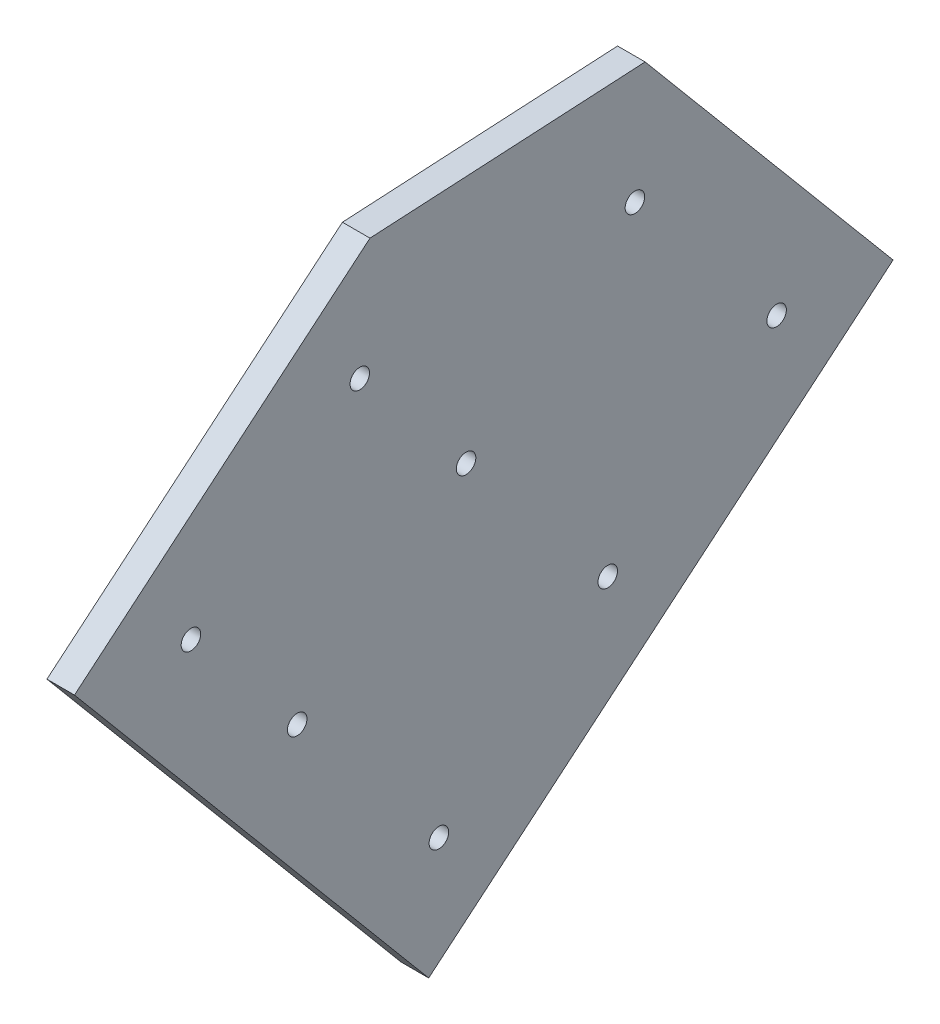
ISO-10303-21;
HEADER;
FILE_DESCRIPTION(('STEP AP214'),'2;1');
FILE_NAME('part.step','',(''),(''),'','','');
FILE_SCHEMA(('AUTOMOTIVE_DESIGN { 1 0 10303 214 1 1 1 1 }'));
ENDSEC;
DATA;
#1=APPLICATION_CONTEXT('core data for automotive mechanical design processes');
#2=APPLICATION_PROTOCOL_DEFINITION('international standard','automotive_design',2000,#1);
#3=PRODUCT_CONTEXT('',#1,'mechanical');
#4=PRODUCT('Part','Part','',(#3));
#5=PRODUCT_RELATED_PRODUCT_CATEGORY('part','',(#4));
#6=PRODUCT_DEFINITION_FORMATION('','',#4);
#7=PRODUCT_DEFINITION_CONTEXT('part definition',#1,'design');
#8=PRODUCT_DEFINITION('design','',#6,#7);
#9=PRODUCT_DEFINITION_SHAPE('','',#8);
#10=(LENGTH_UNIT() NAMED_UNIT(*) SI_UNIT(.MILLI.,.METRE.));
#11=(NAMED_UNIT(*) PLANE_ANGLE_UNIT() SI_UNIT($,.RADIAN.));
#12=(NAMED_UNIT(*) SI_UNIT($,.STERADIAN.) SOLID_ANGLE_UNIT());
#13=UNCERTAINTY_MEASURE_WITH_UNIT(LENGTH_MEASURE(1.E-05),#10,'distance_accuracy_value','');
#14=(GEOMETRIC_REPRESENTATION_CONTEXT(3) GLOBAL_UNCERTAINTY_ASSIGNED_CONTEXT((#13)) GLOBAL_UNIT_ASSIGNED_CONTEXT((#10,
#11,#12)) REPRESENTATION_CONTEXT('',''));
#15=CARTESIAN_POINT('',(0.,0.,0.));
#16=DIRECTION('',(0.,0.,1.));
#17=DIRECTION('',(1.,0.,0.));
#18=AXIS2_PLACEMENT_3D('',#15,#16,#17);
#19=CARTESIAN_POINT('',(50.9270000000001,-283.843632269091,871.911988961986));
#20=DIRECTION('',(0.,-0.766044443118978,-0.64278760968654));
#21=DIRECTION('',(0.,0.64278760968654,-0.766044443118978));
#22=AXIS2_PLACEMENT_3D('',#19,#20,#21);
#23=PLANE('',#22);
#24=DIRECTION('',(0.,0.64278760968654,-0.766044443118978));
#25=VECTOR('',#24,1.);
#26=CARTESIAN_POINT('',(57.2770000000001,-283.843632269091,871.911988961986));
#27=LINE('',#26,#25);
#28=CARTESIAN_POINT('',(57.2770000000001,-340.987450770225,940.013339955263));
#29=VERTEX_POINT('',#28);
#30=CARTESIAN_POINT('',(57.2770000000001,-283.843632269091,871.911988961986));
#31=VERTEX_POINT('',#30);
#32=EDGE_CURVE('E117',#29,#31,#27,.T.);
#33=ORIENTED_EDGE('',*,*,#32,.T.);
#34=DIRECTION('',(1.,0.,0.));
#35=VECTOR('',#34,1.);
#36=CARTESIAN_POINT('',(50.9270000000001,-283.843632269091,871.911988961986));
#37=LINE('',#36,#35);
#38=CARTESIAN_POINT('',(50.9270000000001,-283.843632269091,871.911988961986));
#39=VERTEX_POINT('',#38);
#40=EDGE_CURVE('E11',#39,#31,#37,.T.);
#41=ORIENTED_EDGE('',*,*,#40,.F.);
#42=DIRECTION('',(0.,0.64278760968654,-0.766044443118978));
#43=VECTOR('',#42,1.);
#44=CARTESIAN_POINT('',(50.9270000000001,-283.843632269091,871.911988961986));
#45=LINE('',#44,#43);
#46=CARTESIAN_POINT('',(50.9270000000001,-340.987450770225,940.013339955263));
#47=VERTEX_POINT('',#46);
#48=EDGE_CURVE('E131',#47,#39,#45,.T.);
#49=ORIENTED_EDGE('',*,*,#48,.F.);
#50=DIRECTION('',(1.,0.,0.));
#51=VECTOR('',#50,1.);
#52=CARTESIAN_POINT('',(50.9270000000001,-340.987450770225,940.013339955263));
#53=LINE('',#52,#51);
#54=EDGE_CURVE('E113',#47,#29,#53,.T.);
#55=ORIENTED_EDGE('',*,*,#54,.T.);
#56=EDGE_LOOP('',(#33,#41,#49,#55));
#57=FACE_BOUND('',#56,.T.);
#58=ADVANCED_FACE('F38',(#57),#23,.F.);
#59=CARTESIAN_POINT('',(50.9270000000001,-280.376314979848,808.506723322485));
#60=DIRECTION('',(0.,-0.998508120307106,-0.0546034218778467));
#61=DIRECTION('',(0.,0.0546034218778467,-0.998508120307106));
#62=AXIS2_PLACEMENT_3D('',#59,#60,#61);
#63=PLANE('',#62);
#64=DIRECTION('',(0.,0.0546034218778467,-0.998508120307106));
#65=VECTOR('',#64,1.);
#66=CARTESIAN_POINT('',(57.2770000000001,-280.376314979848,808.506723322485));
#67=LINE('',#66,#65);
#68=CARTESIAN_POINT('',(57.2770000000001,-280.376314979848,808.506723322485));
#69=VERTEX_POINT('',#68);
#70=EDGE_CURVE('E121',#31,#69,#67,.T.);
#71=ORIENTED_EDGE('',*,*,#70,.T.);
#72=DIRECTION('',(1.,0.,0.));
#73=VECTOR('',#72,1.);
#74=CARTESIAN_POINT('',(50.9270000000001,-280.376314979848,808.506723322485));
#75=LINE('',#74,#73);
#76=CARTESIAN_POINT('',(50.9270000000001,-280.376314979848,808.506723322485));
#77=VERTEX_POINT('',#76);
#78=EDGE_CURVE('E47',#77,#69,#75,.T.);
#79=ORIENTED_EDGE('',*,*,#78,.F.);
#80=DIRECTION('',(0.,0.0546034218778467,-0.998508120307106));
#81=VECTOR('',#80,1.);
#82=CARTESIAN_POINT('',(50.9270000000001,-280.376314979848,808.506723322485));
#83=LINE('',#82,#81);
#84=EDGE_CURVE('E89',#39,#77,#83,.T.);
#85=ORIENTED_EDGE('',*,*,#84,.F.);
#86=ORIENTED_EDGE('',*,*,#40,.T.);
#87=EDGE_LOOP('',(#71,#79,#85,#86));
#88=FACE_BOUND('',#87,.T.);
#89=ADVANCED_FACE('F154',(#88),#63,.F.);
#90=CARTESIAN_POINT('',(50.9270000000001,-348.477665973125,751.362904821351));
#91=DIRECTION('',(0.,-0.64278760968654,0.766044443118977));
#92=DIRECTION('',(0.,-0.766044443118977,-0.64278760968654));
#93=AXIS2_PLACEMENT_3D('',#90,#91,#92);
#94=PLANE('',#93);
#95=DIRECTION('',(0.,-0.766044443118977,-0.64278760968654));
#96=VECTOR('',#95,1.);
#97=CARTESIAN_POINT('',(57.2770000000001,-348.477665973125,751.362904821351));
#98=LINE('',#97,#96);
#99=CARTESIAN_POINT('',(57.2770000000001,-348.477665973125,751.362904821351));
#100=VERTEX_POINT('',#99);
#101=EDGE_CURVE('E105',#69,#100,#98,.T.);
#102=ORIENTED_EDGE('',*,*,#101,.T.);
#103=DIRECTION('',(1.,0.,0.));
#104=VECTOR('',#103,1.);
#105=CARTESIAN_POINT('',(50.9270000000001,-348.477665973125,751.362904821351));
#106=LINE('',#105,#104);
#107=CARTESIAN_POINT('',(50.9270000000001,-348.477665973125,751.362904821351));
#108=VERTEX_POINT('',#107);
#109=EDGE_CURVE('E102',#108,#100,#106,.T.);
#110=ORIENTED_EDGE('',*,*,#109,.F.);
#111=DIRECTION('',(0.,-0.766044443118977,-0.64278760968654));
#112=VECTOR('',#111,1.);
#113=CARTESIAN_POINT('',(50.9270000000001,-348.477665973125,751.362904821351));
#114=LINE('',#113,#112);
#115=EDGE_CURVE('E93',#77,#108,#114,.T.);
#116=ORIENTED_EDGE('',*,*,#115,.F.);
#117=ORIENTED_EDGE('',*,*,#78,.T.);
#118=EDGE_LOOP('',(#102,#110,#116,#117));
#119=FACE_BOUND('',#118,.T.);
#120=ADVANCED_FACE('F103',(#119),#94,.F.);
#121=CARTESIAN_POINT('',(50.9270000000001,-438.275095046335,858.379313525072));
#122=DIRECTION('',(0.,0.766044443118977,0.642787609686541));
#123=DIRECTION('',(0.,-0.642787609686541,0.766044443118977));
#124=AXIS2_PLACEMENT_3D('',#121,#122,#123);
#125=PLANE('',#124);
#126=DIRECTION('',(0.,-0.642787609686541,0.766044443118977));
#127=VECTOR('',#126,1.);
#128=CARTESIAN_POINT('',(57.2770000000001,-438.275095046335,858.379313525072));
#129=LINE('',#128,#127);
#130=CARTESIAN_POINT('',(57.2770000000001,-438.275095046335,858.379313525072));
#131=VERTEX_POINT('',#130);
#132=EDGE_CURVE('E75',#100,#131,#129,.T.);
#133=ORIENTED_EDGE('',*,*,#132,.T.);
#134=DIRECTION('',(1.,0.,0.));
#135=VECTOR('',#134,1.);
#136=CARTESIAN_POINT('',(50.9270000000001,-438.275095046335,858.379313525072));
#137=LINE('',#136,#135);
#138=CARTESIAN_POINT('',(50.9270000000001,-438.275095046335,858.379313525072));
#139=VERTEX_POINT('',#138);
#140=EDGE_CURVE('E107',#139,#131,#137,.T.);
#141=ORIENTED_EDGE('',*,*,#140,.F.);
#142=DIRECTION('',(0.,-0.642787609686541,0.766044443118977));
#143=VECTOR('',#142,1.);
#144=CARTESIAN_POINT('',(50.9270000000001,-438.275095046335,858.379313525072));
#145=LINE('',#144,#143);
#146=EDGE_CURVE('E97',#108,#139,#145,.T.);
#147=ORIENTED_EDGE('',*,*,#146,.F.);
#148=ORIENTED_EDGE('',*,*,#109,.T.);
#149=EDGE_LOOP('',(#133,#141,#147,#148));
#150=FACE_BOUND('',#149,.T.);
#151=ADVANCED_FACE('F109',(#150),#125,.F.);
#152=CARTESIAN_POINT('',(50.9270000000001,-340.987450770225,940.013339955263));
#153=DIRECTION('',(0.,0.64278760968654,-0.766044443118977));
#154=DIRECTION('',(0.,0.766044443118977,0.642787609686541));
#155=AXIS2_PLACEMENT_3D('',#152,#153,#154);
#156=PLANE('',#155);
#157=DIRECTION('',(0.,0.766044443118977,0.64278760968654));
#158=VECTOR('',#157,1.);
#159=CARTESIAN_POINT('',(57.2770000000001,-340.987450770225,940.013339955263));
#160=LINE('',#159,#158);
#161=EDGE_CURVE('E81',#131,#29,#160,.T.);
#162=ORIENTED_EDGE('',*,*,#161,.T.);
#163=ORIENTED_EDGE('',*,*,#54,.F.);
#164=DIRECTION('',(0.,0.766044443118977,0.64278760968654));
#165=VECTOR('',#164,1.);
#166=CARTESIAN_POINT('',(50.9270000000001,-340.987450770225,940.013339955263));
#167=LINE('',#166,#165);
#168=EDGE_CURVE('E55',#139,#47,#167,.T.);
#169=ORIENTED_EDGE('',*,*,#168,.F.);
#170=ORIENTED_EDGE('',*,*,#140,.T.);
#171=EDGE_LOOP('',(#162,#163,#169,#170));
#172=FACE_BOUND('',#171,.T.);
#173=ADVANCED_FACE('F142',(#172),#156,.F.);
#174=CARTESIAN_POINT('',(50.927,0.,0.));
#175=DIRECTION('',(1.,0.,0.));
#176=DIRECTION('',(0.,1.,0.));
#177=AXIS2_PLACEMENT_3D('',#174,#175,#176);
#178=PLANE('',#177);
#179=CARTESIAN_POINT('',(50.9270000000001,-310.681882875036,874.260031638874));
#180=DIRECTION('',(-1.,0.,0.));
#181=DIRECTION('',(0.,0.,1.));
#182=AXIS2_PLACEMENT_3D('',#179,#180,#181);
#183=CIRCLE('',#182,4.21640000000001);
#184=CARTESIAN_POINT('',(50.9270000000001,-310.681882875036,878.476431638874));
#185=VERTEX_POINT('',#184);
#186=EDGE_CURVE('E358',#185,#185,#183,.T.);
#187=ORIENTED_EDGE('',*,*,#186,.F.);
#188=EDGE_LOOP('',(#187));
#189=FACE_BOUND('',#188,.T.);
#190=CARTESIAN_POINT('',(50.9270000000002,-343.335493447113,913.175089349318));
#191=DIRECTION('',(-1.,0.,0.));
#192=DIRECTION('',(0.,0.,1.));
#193=AXIS2_PLACEMENT_3D('',#190,#191,#192);
#194=CIRCLE('',#193,4.21640000000001);
#195=CARTESIAN_POINT('',(50.9270000000002,-343.335493447113,917.391489349318));
#196=VERTEX_POINT('',#195);
#197=EDGE_CURVE('E368',#196,#196,#194,.T.);
#198=ORIENTED_EDGE('',*,*,#197,.F.);
#199=EDGE_LOOP('',(#198));
#200=FACE_BOUND('',#199,.T.);
#201=CARTESIAN_POINT('',(50.9270000000002,-372.521786729946,888.684881420261));
#202=DIRECTION('',(-1.,0.,0.));
#203=DIRECTION('',(0.,0.,1.));
#204=AXIS2_PLACEMENT_3D('',#201,#202,#203);
#205=CIRCLE('',#204,4.21640000000001);
#206=CARTESIAN_POINT('',(50.9270000000002,-372.521786729946,892.901281420261));
#207=VERTEX_POINT('',#206);
#208=EDGE_CURVE('E380',#207,#207,#205,.T.);
#209=ORIENTED_EDGE('',*,*,#208,.F.);
#210=EDGE_LOOP('',(#209));
#211=FACE_BOUND('',#210,.T.);
#212=CARTESIAN_POINT('',(50.9270000000002,-411.43684444039,856.031270848185));
#213=DIRECTION('',(-1.,0.,0.));
#214=DIRECTION('',(0.,0.,1.));
#215=AXIS2_PLACEMENT_3D('',#212,#213,#214);
#216=CIRCLE('',#215,4.21640000000001);
#217=CARTESIAN_POINT('',(50.9270000000002,-411.43684444039,860.247670848185));
#218=VERTEX_POINT('',#217);
#219=EDGE_CURVE('E392',#218,#218,#216,.T.);
#220=ORIENTED_EDGE('',*,*,#219,.F.);
#221=EDGE_LOOP('',(#220));
#222=FACE_BOUND('',#221,.T.);
#223=CARTESIAN_POINT('',(50.9270000000002,-339.86817615787,849.769823709817));
#224=DIRECTION('',(-1.,0.,0.));
#225=DIRECTION('',(0.,0.,1.));
#226=AXIS2_PLACEMENT_3D('',#223,#224,#225);
#227=CIRCLE('',#226,4.21640000000001);
#228=CARTESIAN_POINT('',(50.9270000000002,-339.86817615787,853.986223709817));
#229=VERTEX_POINT('',#228);
#230=EDGE_CURVE('E404',#229,#229,#227,.T.);
#231=ORIENTED_EDGE('',*,*,#230,.F.);
#232=EDGE_LOOP('',(#231));
#233=FACE_BOUND('',#232,.T.);
#234=CARTESIAN_POINT('',(50.9270000000002,-378.783233868313,817.116213137741));
#235=DIRECTION('',(-1.,0.,0.));
#236=DIRECTION('',(0.,0.,1.));
#237=AXIS2_PLACEMENT_3D('',#234,#235,#236);
#238=CIRCLE('',#237,4.21640000000001);
#239=CARTESIAN_POINT('',(50.9270000000002,-378.783233868313,821.332613137741));
#240=VERTEX_POINT('',#239);
#241=EDGE_CURVE('E416',#240,#240,#238,.T.);
#242=ORIENTED_EDGE('',*,*,#241,.F.);
#243=EDGE_LOOP('',(#242));
#244=FACE_BOUND('',#243,.T.);
#245=CARTESIAN_POINT('',(50.9270000000001,-346.129623296237,778.201155427296));
#246=DIRECTION('',(-1.,0.,0.));
#247=DIRECTION('',(0.,0.,1.));
#248=AXIS2_PLACEMENT_3D('',#245,#246,#247);
#249=CIRCLE('',#248,4.21640000000001);
#250=CARTESIAN_POINT('',(50.9270000000001,-346.129623296237,782.417555427296));
#251=VERTEX_POINT('',#250);
#252=EDGE_CURVE('E428',#251,#251,#249,.T.);
#253=ORIENTED_EDGE('',*,*,#252,.F.);
#254=EDGE_LOOP('',(#253));
#255=FACE_BOUND('',#254,.T.);
#256=CARTESIAN_POINT('',(50.9270000000001,-307.214565585793,810.854765999373));
#257=DIRECTION('',(-1.,0.,0.));
#258=DIRECTION('',(0.,0.,1.));
#259=AXIS2_PLACEMENT_3D('',#256,#257,#258);
#260=CIRCLE('',#259,4.21640000000001);
#261=CARTESIAN_POINT('',(50.9270000000001,-307.214565585793,815.071165999373));
#262=VERTEX_POINT('',#261);
#263=EDGE_CURVE('E440',#262,#262,#260,.T.);
#264=ORIENTED_EDGE('',*,*,#263,.F.);
#265=EDGE_LOOP('',(#264));
#266=FACE_BOUND('',#265,.T.);
#267=ORIENTED_EDGE('',*,*,#48,.T.);
#268=ORIENTED_EDGE('',*,*,#84,.T.);
#269=ORIENTED_EDGE('',*,*,#115,.T.);
#270=ORIENTED_EDGE('',*,*,#146,.T.);
#271=ORIENTED_EDGE('',*,*,#168,.T.);
#272=EDGE_LOOP('',(#267,#268,#269,#270,#271));
#273=FACE_BOUND('',#272,.T.);
#274=ADVANCED_FACE('F95',(#189,#200,#211,#222,#233,#244,#255,#266,#273),#178,.F.);
#275=CARTESIAN_POINT('',(57.2770000000001,0.,0.));
#276=DIRECTION('',(1.,0.,0.));
#277=DIRECTION('',(0.,1.,0.));
#278=AXIS2_PLACEMENT_3D('',#275,#276,#277);
#279=PLANE('',#278);
#280=CARTESIAN_POINT('',(57.2770000000001,-310.681882875036,874.260031638874));
#281=DIRECTION('',(-1.,0.,0.));
#282=DIRECTION('',(0.,0.,1.));
#283=AXIS2_PLACEMENT_3D('',#280,#281,#282);
#284=CIRCLE('',#283,2.24789999999997);
#285=CARTESIAN_POINT('',(57.2770000000001,-310.681882875036,876.507931638874));
#286=VERTEX_POINT('',#285);
#287=EDGE_CURVE('E362',#286,#286,#284,.T.);
#288=ORIENTED_EDGE('',*,*,#287,.T.);
#289=EDGE_LOOP('',(#288));
#290=FACE_BOUND('',#289,.T.);
#291=CARTESIAN_POINT('',(57.2770000000002,-343.335493447113,913.175089349318));
#292=DIRECTION('',(-1.,0.,0.));
#293=DIRECTION('',(0.,0.,1.));
#294=AXIS2_PLACEMENT_3D('',#291,#292,#293);
#295=CIRCLE('',#294,2.24789999999997);
#296=CARTESIAN_POINT('',(57.2770000000002,-343.335493447113,915.422989349318));
#297=VERTEX_POINT('',#296);
#298=EDGE_CURVE('E376',#297,#297,#295,.T.);
#299=ORIENTED_EDGE('',*,*,#298,.T.);
#300=EDGE_LOOP('',(#299));
#301=FACE_BOUND('',#300,.T.);
#302=CARTESIAN_POINT('',(57.2770000000002,-372.521786729946,888.684881420261));
#303=DIRECTION('',(-1.,0.,0.));
#304=DIRECTION('',(0.,0.,1.));
#305=AXIS2_PLACEMENT_3D('',#302,#303,#304);
#306=CIRCLE('',#305,2.24789999999997);
#307=CARTESIAN_POINT('',(57.2770000000002,-372.521786729946,890.932781420261));
#308=VERTEX_POINT('',#307);
#309=EDGE_CURVE('E388',#308,#308,#306,.T.);
#310=ORIENTED_EDGE('',*,*,#309,.T.);
#311=EDGE_LOOP('',(#310));
#312=FACE_BOUND('',#311,.T.);
#313=CARTESIAN_POINT('',(57.2770000000002,-411.43684444039,856.031270848185));
#314=DIRECTION('',(-1.,0.,0.));
#315=DIRECTION('',(0.,0.,1.));
#316=AXIS2_PLACEMENT_3D('',#313,#314,#315);
#317=CIRCLE('',#316,2.24789999999997);
#318=CARTESIAN_POINT('',(57.2770000000002,-411.43684444039,858.279170848185));
#319=VERTEX_POINT('',#318);
#320=EDGE_CURVE('E400',#319,#319,#317,.T.);
#321=ORIENTED_EDGE('',*,*,#320,.T.);
#322=EDGE_LOOP('',(#321));
#323=FACE_BOUND('',#322,.T.);
#324=CARTESIAN_POINT('',(57.2770000000002,-339.86817615787,849.769823709817));
#325=DIRECTION('',(-1.,0.,0.));
#326=DIRECTION('',(0.,0.,1.));
#327=AXIS2_PLACEMENT_3D('',#324,#325,#326);
#328=CIRCLE('',#327,2.24789999999997);
#329=CARTESIAN_POINT('',(57.2770000000002,-339.86817615787,852.017723709817));
#330=VERTEX_POINT('',#329);
#331=EDGE_CURVE('E412',#330,#330,#328,.T.);
#332=ORIENTED_EDGE('',*,*,#331,.T.);
#333=EDGE_LOOP('',(#332));
#334=FACE_BOUND('',#333,.T.);
#335=CARTESIAN_POINT('',(57.2770000000002,-378.783233868313,817.116213137741));
#336=DIRECTION('',(-1.,0.,0.));
#337=DIRECTION('',(0.,0.,1.));
#338=AXIS2_PLACEMENT_3D('',#335,#336,#337);
#339=CIRCLE('',#338,2.24789999999997);
#340=CARTESIAN_POINT('',(57.2770000000002,-378.783233868313,819.364113137741));
#341=VERTEX_POINT('',#340);
#342=EDGE_CURVE('E424',#341,#341,#339,.T.);
#343=ORIENTED_EDGE('',*,*,#342,.T.);
#344=EDGE_LOOP('',(#343));
#345=FACE_BOUND('',#344,.T.);
#346=CARTESIAN_POINT('',(57.2770000000001,-346.129623296237,778.201155427296));
#347=DIRECTION('',(-1.,0.,0.));
#348=DIRECTION('',(0.,0.,1.));
#349=AXIS2_PLACEMENT_3D('',#346,#347,#348);
#350=CIRCLE('',#349,2.24789999999997);
#351=CARTESIAN_POINT('',(57.2770000000001,-346.129623296237,780.449055427296));
#352=VERTEX_POINT('',#351);
#353=EDGE_CURVE('E436',#352,#352,#350,.T.);
#354=ORIENTED_EDGE('',*,*,#353,.T.);
#355=EDGE_LOOP('',(#354));
#356=FACE_BOUND('',#355,.T.);
#357=CARTESIAN_POINT('',(57.2770000000001,-307.214565585793,810.854765999373));
#358=DIRECTION('',(-1.,0.,0.));
#359=DIRECTION('',(0.,0.,1.));
#360=AXIS2_PLACEMENT_3D('',#357,#358,#359);
#361=CIRCLE('',#360,2.24789999999997);
#362=CARTESIAN_POINT('',(57.2770000000001,-307.214565585793,813.102665999373));
#363=VERTEX_POINT('',#362);
#364=EDGE_CURVE('E122',#363,#363,#361,.T.);
#365=ORIENTED_EDGE('',*,*,#364,.T.);
#366=EDGE_LOOP('',(#365));
#367=FACE_BOUND('',#366,.T.);
#368=ORIENTED_EDGE('',*,*,#32,.F.);
#369=ORIENTED_EDGE('',*,*,#161,.F.);
#370=ORIENTED_EDGE('',*,*,#132,.F.);
#371=ORIENTED_EDGE('',*,*,#101,.F.);
#372=ORIENTED_EDGE('',*,*,#70,.F.);
#373=EDGE_LOOP('',(#368,#369,#370,#371,#372));
#374=FACE_BOUND('',#373,.T.);
#375=ADVANCED_FACE('F138',(#290,#301,#312,#323,#334,#345,#356,#367,#374),#279,.T.);
#376=CARTESIAN_POINT('',(50.9270000000001,-307.214565585793,810.854765999373));
#377=DIRECTION('',(-1.,0.,0.));
#378=DIRECTION('',(0.,0.,1.));
#379=AXIS2_PLACEMENT_3D('',#376,#377,#378);
#380=CYLINDRICAL_SURFACE('',#379,2.24789999999997);
#381=ORIENTED_EDGE('',*,*,#364,.F.);
#382=EDGE_LOOP('',(#381));
#383=FACE_BOUND('',#382,.T.);
#384=CARTESIAN_POINT('',(52.5787676239726,-307.214565585793,810.854765999373));
#385=DIRECTION('',(-1.,0.,0.));
#386=DIRECTION('',(0.,0.,1.));
#387=AXIS2_PLACEMENT_3D('',#384,#385,#386);
#388=CIRCLE('',#387,2.24789999999997);
#389=CARTESIAN_POINT('',(52.5787676239726,-307.214565585793,813.102665999373));
#390=VERTEX_POINT('',#389);
#391=EDGE_CURVE('E444',#390,#390,#388,.T.);
#392=ORIENTED_EDGE('',*,*,#391,.T.);
#393=EDGE_LOOP('',(#392));
#394=FACE_BOUND('',#393,.T.);
#395=ADVANCED_FACE('F190',(#383,#394),#380,.F.);
#396=CARTESIAN_POINT('',(50.9270000000001,-307.214565585793,810.854765999373));
#397=DIRECTION('',(-1.,0.,0.));
#398=DIRECTION('',(0.,0.,1.));
#399=AXIS2_PLACEMENT_3D('',#396,#397,#398);
#400=CONICAL_SURFACE('',#399,4.21640000000001,0.872664625997177);
#401=ORIENTED_EDGE('',*,*,#391,.F.);
#402=EDGE_LOOP('',(#401));
#403=FACE_BOUND('',#402,.T.);
#404=ORIENTED_EDGE('',*,*,#263,.T.);
#405=EDGE_LOOP('',(#404));
#406=FACE_BOUND('',#405,.T.);
#407=ADVANCED_FACE('F199',(#403,#406),#400,.F.);
#408=CARTESIAN_POINT('',(50.9270000000001,-346.129623296237,778.201155427296));
#409=DIRECTION('',(-1.,0.,0.));
#410=DIRECTION('',(0.,0.,1.));
#411=AXIS2_PLACEMENT_3D('',#408,#409,#410);
#412=CYLINDRICAL_SURFACE('',#411,2.24789999999997);
#413=ORIENTED_EDGE('',*,*,#353,.F.);
#414=EDGE_LOOP('',(#413));
#415=FACE_BOUND('',#414,.T.);
#416=CARTESIAN_POINT('',(52.5787676239726,-346.129623296237,778.201155427296));
#417=DIRECTION('',(-1.,0.,0.));
#418=DIRECTION('',(0.,0.,1.));
#419=AXIS2_PLACEMENT_3D('',#416,#417,#418);
#420=CIRCLE('',#419,2.24789999999997);
#421=CARTESIAN_POINT('',(52.5787676239726,-346.129623296237,780.449055427296));
#422=VERTEX_POINT('',#421);
#423=EDGE_CURVE('E432',#422,#422,#420,.T.);
#424=ORIENTED_EDGE('',*,*,#423,.T.);
#425=EDGE_LOOP('',(#424));
#426=FACE_BOUND('',#425,.T.);
#427=ADVANCED_FACE('F209',(#415,#426),#412,.F.);
#428=CARTESIAN_POINT('',(50.9270000000001,-346.129623296237,778.201155427296));
#429=DIRECTION('',(-1.,0.,0.));
#430=DIRECTION('',(0.,0.,1.));
#431=AXIS2_PLACEMENT_3D('',#428,#429,#430);
#432=CONICAL_SURFACE('',#431,4.21640000000001,0.872664625997177);
#433=ORIENTED_EDGE('',*,*,#423,.F.);
#434=EDGE_LOOP('',(#433));
#435=FACE_BOUND('',#434,.T.);
#436=ORIENTED_EDGE('',*,*,#252,.T.);
#437=EDGE_LOOP('',(#436));
#438=FACE_BOUND('',#437,.T.);
#439=ADVANCED_FACE('F219',(#435,#438),#432,.F.);
#440=CARTESIAN_POINT('',(50.9270000000002,-378.783233868313,817.116213137741));
#441=DIRECTION('',(-1.,0.,0.));
#442=DIRECTION('',(0.,0.,1.));
#443=AXIS2_PLACEMENT_3D('',#440,#441,#442);
#444=CYLINDRICAL_SURFACE('',#443,2.24789999999997);
#445=ORIENTED_EDGE('',*,*,#342,.F.);
#446=EDGE_LOOP('',(#445));
#447=FACE_BOUND('',#446,.T.);
#448=CARTESIAN_POINT('',(52.5787676239726,-378.783233868313,817.116213137741));
#449=DIRECTION('',(-1.,0.,0.));
#450=DIRECTION('',(0.,0.,1.));
#451=AXIS2_PLACEMENT_3D('',#448,#449,#450);
#452=CIRCLE('',#451,2.24789999999997);
#453=CARTESIAN_POINT('',(52.5787676239726,-378.783233868313,819.364113137741));
#454=VERTEX_POINT('',#453);
#455=EDGE_CURVE('E420',#454,#454,#452,.T.);
#456=ORIENTED_EDGE('',*,*,#455,.T.);
#457=EDGE_LOOP('',(#456));
#458=FACE_BOUND('',#457,.T.);
#459=ADVANCED_FACE('F229',(#447,#458),#444,.F.);
#460=CARTESIAN_POINT('',(50.9270000000002,-378.783233868313,817.116213137741));
#461=DIRECTION('',(-1.,0.,0.));
#462=DIRECTION('',(0.,0.,1.));
#463=AXIS2_PLACEMENT_3D('',#460,#461,#462);
#464=CONICAL_SURFACE('',#463,4.21640000000001,0.872664625997177);
#465=ORIENTED_EDGE('',*,*,#455,.F.);
#466=EDGE_LOOP('',(#465));
#467=FACE_BOUND('',#466,.T.);
#468=ORIENTED_EDGE('',*,*,#241,.T.);
#469=EDGE_LOOP('',(#468));
#470=FACE_BOUND('',#469,.T.);
#471=ADVANCED_FACE('F239',(#467,#470),#464,.F.);
#472=CARTESIAN_POINT('',(50.9270000000002,-339.86817615787,849.769823709817));
#473=DIRECTION('',(-1.,0.,0.));
#474=DIRECTION('',(0.,0.,1.));
#475=AXIS2_PLACEMENT_3D('',#472,#473,#474);
#476=CYLINDRICAL_SURFACE('',#475,2.24789999999997);
#477=ORIENTED_EDGE('',*,*,#331,.F.);
#478=EDGE_LOOP('',(#477));
#479=FACE_BOUND('',#478,.T.);
#480=CARTESIAN_POINT('',(52.5787676239726,-339.86817615787,849.769823709817));
#481=DIRECTION('',(-1.,0.,0.));
#482=DIRECTION('',(0.,0.,1.));
#483=AXIS2_PLACEMENT_3D('',#480,#481,#482);
#484=CIRCLE('',#483,2.24789999999997);
#485=CARTESIAN_POINT('',(52.5787676239726,-339.86817615787,852.017723709817));
#486=VERTEX_POINT('',#485);
#487=EDGE_CURVE('E408',#486,#486,#484,.T.);
#488=ORIENTED_EDGE('',*,*,#487,.T.);
#489=EDGE_LOOP('',(#488));
#490=FACE_BOUND('',#489,.T.);
#491=ADVANCED_FACE('F249',(#479,#490),#476,.F.);
#492=CARTESIAN_POINT('',(50.9270000000002,-339.86817615787,849.769823709817));
#493=DIRECTION('',(-1.,0.,0.));
#494=DIRECTION('',(0.,0.,1.));
#495=AXIS2_PLACEMENT_3D('',#492,#493,#494);
#496=CONICAL_SURFACE('',#495,4.21640000000001,0.872664625997177);
#497=ORIENTED_EDGE('',*,*,#487,.F.);
#498=EDGE_LOOP('',(#497));
#499=FACE_BOUND('',#498,.T.);
#500=ORIENTED_EDGE('',*,*,#230,.T.);
#501=EDGE_LOOP('',(#500));
#502=FACE_BOUND('',#501,.T.);
#503=ADVANCED_FACE('F259',(#499,#502),#496,.F.);
#504=CARTESIAN_POINT('',(50.9270000000002,-411.43684444039,856.031270848185));
#505=DIRECTION('',(-1.,0.,0.));
#506=DIRECTION('',(0.,0.,1.));
#507=AXIS2_PLACEMENT_3D('',#504,#505,#506);
#508=CYLINDRICAL_SURFACE('',#507,2.24789999999997);
#509=ORIENTED_EDGE('',*,*,#320,.F.);
#510=EDGE_LOOP('',(#509));
#511=FACE_BOUND('',#510,.T.);
#512=CARTESIAN_POINT('',(52.5787676239726,-411.43684444039,856.031270848185));
#513=DIRECTION('',(-1.,0.,0.));
#514=DIRECTION('',(0.,0.,1.));
#515=AXIS2_PLACEMENT_3D('',#512,#513,#514);
#516=CIRCLE('',#515,2.24789999999997);
#517=CARTESIAN_POINT('',(52.5787676239726,-411.43684444039,858.279170848185));
#518=VERTEX_POINT('',#517);
#519=EDGE_CURVE('E396',#518,#518,#516,.T.);
#520=ORIENTED_EDGE('',*,*,#519,.T.);
#521=EDGE_LOOP('',(#520));
#522=FACE_BOUND('',#521,.T.);
#523=ADVANCED_FACE('F269',(#511,#522),#508,.F.);
#524=CARTESIAN_POINT('',(50.9270000000002,-411.43684444039,856.031270848185));
#525=DIRECTION('',(-1.,0.,0.));
#526=DIRECTION('',(0.,0.,1.));
#527=AXIS2_PLACEMENT_3D('',#524,#525,#526);
#528=CONICAL_SURFACE('',#527,4.21640000000001,0.872664625997177);
#529=ORIENTED_EDGE('',*,*,#519,.F.);
#530=EDGE_LOOP('',(#529));
#531=FACE_BOUND('',#530,.T.);
#532=ORIENTED_EDGE('',*,*,#219,.T.);
#533=EDGE_LOOP('',(#532));
#534=FACE_BOUND('',#533,.T.);
#535=ADVANCED_FACE('F279',(#531,#534),#528,.F.);
#536=CARTESIAN_POINT('',(50.9270000000002,-372.521786729946,888.684881420261));
#537=DIRECTION('',(-1.,0.,0.));
#538=DIRECTION('',(0.,0.,1.));
#539=AXIS2_PLACEMENT_3D('',#536,#537,#538);
#540=CYLINDRICAL_SURFACE('',#539,2.24789999999997);
#541=ORIENTED_EDGE('',*,*,#309,.F.);
#542=EDGE_LOOP('',(#541));
#543=FACE_BOUND('',#542,.T.);
#544=CARTESIAN_POINT('',(52.5787676239726,-372.521786729946,888.684881420261));
#545=DIRECTION('',(-1.,0.,0.));
#546=DIRECTION('',(0.,0.,1.));
#547=AXIS2_PLACEMENT_3D('',#544,#545,#546);
#548=CIRCLE('',#547,2.24789999999997);
#549=CARTESIAN_POINT('',(52.5787676239726,-372.521786729946,890.932781420261));
#550=VERTEX_POINT('',#549);
#551=EDGE_CURVE('E384',#550,#550,#548,.T.);
#552=ORIENTED_EDGE('',*,*,#551,.T.);
#553=EDGE_LOOP('',(#552));
#554=FACE_BOUND('',#553,.T.);
#555=ADVANCED_FACE('F289',(#543,#554),#540,.F.);
#556=CARTESIAN_POINT('',(50.9270000000002,-372.521786729946,888.684881420261));
#557=DIRECTION('',(-1.,0.,0.));
#558=DIRECTION('',(0.,0.,1.));
#559=AXIS2_PLACEMENT_3D('',#556,#557,#558);
#560=CONICAL_SURFACE('',#559,4.21640000000001,0.872664625997177);
#561=ORIENTED_EDGE('',*,*,#551,.F.);
#562=EDGE_LOOP('',(#561));
#563=FACE_BOUND('',#562,.T.);
#564=ORIENTED_EDGE('',*,*,#208,.T.);
#565=EDGE_LOOP('',(#564));
#566=FACE_BOUND('',#565,.T.);
#567=ADVANCED_FACE('F299',(#563,#566),#560,.F.);
#568=CARTESIAN_POINT('',(50.9270000000002,-343.335493447113,913.175089349318));
#569=DIRECTION('',(-1.,0.,0.));
#570=DIRECTION('',(0.,0.,1.));
#571=AXIS2_PLACEMENT_3D('',#568,#569,#570);
#572=CYLINDRICAL_SURFACE('',#571,2.24789999999997);
#573=ORIENTED_EDGE('',*,*,#298,.F.);
#574=EDGE_LOOP('',(#573));
#575=FACE_BOUND('',#574,.T.);
#576=CARTESIAN_POINT('',(52.5787676239726,-343.335493447113,913.175089349318));
#577=DIRECTION('',(-1.,0.,0.));
#578=DIRECTION('',(0.,0.,1.));
#579=AXIS2_PLACEMENT_3D('',#576,#577,#578);
#580=CIRCLE('',#579,2.24789999999997);
#581=CARTESIAN_POINT('',(52.5787676239726,-343.335493447113,915.422989349318));
#582=VERTEX_POINT('',#581);
#583=EDGE_CURVE('E372',#582,#582,#580,.T.);
#584=ORIENTED_EDGE('',*,*,#583,.T.);
#585=EDGE_LOOP('',(#584));
#586=FACE_BOUND('',#585,.T.);
#587=ADVANCED_FACE('F309',(#575,#586),#572,.F.);
#588=CARTESIAN_POINT('',(50.9270000000002,-343.335493447113,913.175089349318));
#589=DIRECTION('',(-1.,0.,0.));
#590=DIRECTION('',(0.,0.,1.));
#591=AXIS2_PLACEMENT_3D('',#588,#589,#590);
#592=CONICAL_SURFACE('',#591,4.21640000000001,0.872664625997177);
#593=ORIENTED_EDGE('',*,*,#583,.F.);
#594=EDGE_LOOP('',(#593));
#595=FACE_BOUND('',#594,.T.);
#596=ORIENTED_EDGE('',*,*,#197,.T.);
#597=EDGE_LOOP('',(#596));
#598=FACE_BOUND('',#597,.T.);
#599=ADVANCED_FACE('F319',(#595,#598),#592,.F.);
#600=CARTESIAN_POINT('',(50.9270000000001,-310.681882875036,874.260031638874));
#601=DIRECTION('',(-1.,0.,0.));
#602=DIRECTION('',(0.,0.,1.));
#603=AXIS2_PLACEMENT_3D('',#600,#601,#602);
#604=CYLINDRICAL_SURFACE('',#603,2.24789999999997);
#605=ORIENTED_EDGE('',*,*,#287,.F.);
#606=EDGE_LOOP('',(#605));
#607=FACE_BOUND('',#606,.T.);
#608=CARTESIAN_POINT('',(52.5787676239726,-310.681882875036,874.260031638874));
#609=DIRECTION('',(-1.,0.,0.));
#610=DIRECTION('',(0.,0.,1.));
#611=AXIS2_PLACEMENT_3D('',#608,#609,#610);
#612=CIRCLE('',#611,2.24789999999997);
#613=CARTESIAN_POINT('',(52.5787676239726,-310.681882875036,876.507931638874));
#614=VERTEX_POINT('',#613);
#615=EDGE_CURVE('E355',#614,#614,#612,.T.);
#616=ORIENTED_EDGE('',*,*,#615,.T.);
#617=EDGE_LOOP('',(#616));
#618=FACE_BOUND('',#617,.T.);
#619=ADVANCED_FACE('F329',(#607,#618),#604,.F.);
#620=CARTESIAN_POINT('',(50.9270000000001,-310.681882875036,874.260031638874));
#621=DIRECTION('',(-1.,0.,0.));
#622=DIRECTION('',(0.,0.,1.));
#623=AXIS2_PLACEMENT_3D('',#620,#621,#622);
#624=CONICAL_SURFACE('',#623,4.21640000000001,0.872664625997177);
#625=ORIENTED_EDGE('',*,*,#615,.F.);
#626=EDGE_LOOP('',(#625));
#627=FACE_BOUND('',#626,.T.);
#628=ORIENTED_EDGE('',*,*,#186,.T.);
#629=EDGE_LOOP('',(#628));
#630=FACE_BOUND('',#629,.T.);
#631=ADVANCED_FACE('F339',(#627,#630),#624,.F.);
#632=CLOSED_SHELL('',(#58,#89,#120,#151,#173,#274,#375,#395,#407,#427,#439,#459,#471,#491,#503,
#523,#535,#555,#567,#587,#599,#619,#631));
#633=MANIFOLD_SOLID_BREP('B2',#632);
#634=ADVANCED_BREP_SHAPE_REPRESENTATION('',(#18,#633),#14);
#635=SHAPE_DEFINITION_REPRESENTATION(#9,#634);
ENDSEC;
END-ISO-10303-21;
